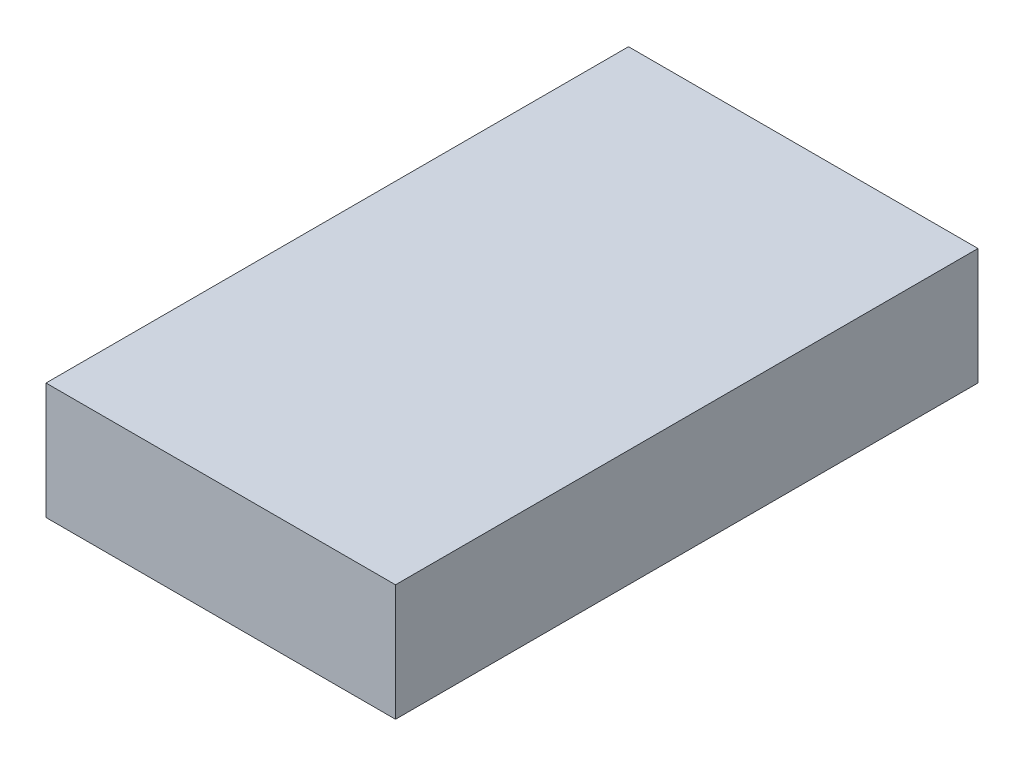
ISO-10303-21;
HEADER;
FILE_DESCRIPTION(('STEP AP214'),'2;1');
FILE_NAME('part.step','',(''),(''),'','','');
FILE_SCHEMA(('AUTOMOTIVE_DESIGN { 1 0 10303 214 1 1 1 1 }'));
ENDSEC;
DATA;
#1=APPLICATION_CONTEXT('core data for automotive mechanical design processes');
#2=APPLICATION_PROTOCOL_DEFINITION('international standard','automotive_design',2000,#1);
#3=PRODUCT_CONTEXT('',#1,'mechanical');
#4=PRODUCT('Part','Part','',(#3));
#5=PRODUCT_RELATED_PRODUCT_CATEGORY('part','',(#4));
#6=PRODUCT_DEFINITION_FORMATION('','',#4);
#7=PRODUCT_DEFINITION_CONTEXT('part definition',#1,'design');
#8=PRODUCT_DEFINITION('design','',#6,#7);
#9=PRODUCT_DEFINITION_SHAPE('','',#8);
#10=(LENGTH_UNIT() NAMED_UNIT(*) SI_UNIT(.MILLI.,.METRE.));
#11=(NAMED_UNIT(*) PLANE_ANGLE_UNIT() SI_UNIT($,.RADIAN.));
#12=(NAMED_UNIT(*) SI_UNIT($,.STERADIAN.) SOLID_ANGLE_UNIT());
#13=UNCERTAINTY_MEASURE_WITH_UNIT(LENGTH_MEASURE(1.E-05),#10,'distance_accuracy_value','');
#14=(GEOMETRIC_REPRESENTATION_CONTEXT(3) GLOBAL_UNCERTAINTY_ASSIGNED_CONTEXT((#13)) GLOBAL_UNIT_ASSIGNED_CONTEXT((#10,
#11,#12)) REPRESENTATION_CONTEXT('',''));
#15=CARTESIAN_POINT('',(0.,0.,0.));
#16=DIRECTION('',(0.,0.,1.));
#17=DIRECTION('',(1.,0.,0.));
#18=AXIS2_PLACEMENT_3D('',#15,#16,#17);
#19=CARTESIAN_POINT('',(75.,50.,125.));
#20=DIRECTION('',(-1.,0.,0.));
#21=DIRECTION('',(0.,0.,1.));
#22=AXIS2_PLACEMENT_3D('',#19,#20,#21);
#23=PLANE('',#22);
#24=DIRECTION('',(0.,0.,-1.));
#25=VECTOR('',#24,1.);
#26=CARTESIAN_POINT('',(75.,0.,125.));
#27=LINE('',#26,#25);
#28=CARTESIAN_POINT('',(75.,0.,125.));
#29=VERTEX_POINT('',#28);
#30=CARTESIAN_POINT('',(75.,0.,-125.));
#31=VERTEX_POINT('',#30);
#32=EDGE_CURVE('E104',#29,#31,#27,.T.);
#33=ORIENTED_EDGE('',*,*,#32,.T.);
#34=DIRECTION('',(0.,-1.,0.));
#35=VECTOR('',#34,1.);
#36=CARTESIAN_POINT('',(75.,50.,-125.));
#37=LINE('',#36,#35);
#38=CARTESIAN_POINT('',(75.,50.,-125.));
#39=VERTEX_POINT('',#38);
#40=EDGE_CURVE('E11',#39,#31,#37,.T.);
#41=ORIENTED_EDGE('',*,*,#40,.F.);
#42=DIRECTION('',(0.,0.,-1.));
#43=VECTOR('',#42,1.);
#44=CARTESIAN_POINT('',(75.,50.,125.));
#45=LINE('',#44,#43);
#46=CARTESIAN_POINT('',(75.,50.,125.));
#47=VERTEX_POINT('',#46);
#48=EDGE_CURVE('E92',#47,#39,#45,.T.);
#49=ORIENTED_EDGE('',*,*,#48,.F.);
#50=DIRECTION('',(0.,-1.,0.));
#51=VECTOR('',#50,1.);
#52=CARTESIAN_POINT('',(75.,50.,125.));
#53=LINE('',#52,#51);
#54=EDGE_CURVE('E100',#47,#29,#53,.T.);
#55=ORIENTED_EDGE('',*,*,#54,.T.);
#56=EDGE_LOOP('',(#33,#41,#49,#55));
#57=FACE_BOUND('',#56,.T.);
#58=ADVANCED_FACE('F41',(#57),#23,.F.);
#59=CARTESIAN_POINT('',(-75.,50.,-125.));
#60=DIRECTION('',(0.,0.,1.));
#61=DIRECTION('',(1.,0.,0.));
#62=AXIS2_PLACEMENT_3D('',#59,#60,#61);
#63=PLANE('',#62);
#64=DIRECTION('',(-1.,0.,0.));
#65=VECTOR('',#64,1.);
#66=CARTESIAN_POINT('',(-75.,0.,-125.));
#67=LINE('',#66,#65);
#68=CARTESIAN_POINT('',(-75.,0.,-125.));
#69=VERTEX_POINT('',#68);
#70=EDGE_CURVE('E96',#31,#69,#67,.T.);
#71=ORIENTED_EDGE('',*,*,#70,.T.);
#72=DIRECTION('',(0.,-1.,0.));
#73=VECTOR('',#72,1.);
#74=CARTESIAN_POINT('',(-75.,50.,-125.));
#75=LINE('',#74,#73);
#76=CARTESIAN_POINT('',(-75.,50.,-125.));
#77=VERTEX_POINT('',#76);
#78=EDGE_CURVE('E49',#77,#69,#75,.T.);
#79=ORIENTED_EDGE('',*,*,#78,.F.);
#80=DIRECTION('',(-1.,0.,0.));
#81=VECTOR('',#80,1.);
#82=CARTESIAN_POINT('',(-75.,50.,-125.));
#83=LINE('',#82,#81);
#84=EDGE_CURVE('E87',#39,#77,#83,.T.);
#85=ORIENTED_EDGE('',*,*,#84,.F.);
#86=ORIENTED_EDGE('',*,*,#40,.T.);
#87=EDGE_LOOP('',(#71,#79,#85,#86));
#88=FACE_BOUND('',#87,.T.);
#89=ADVANCED_FACE('F95',(#88),#63,.F.);
#90=CARTESIAN_POINT('',(-75.,50.,125.));
#91=DIRECTION('',(1.,0.,0.));
#92=DIRECTION('',(0.,0.,-1.));
#93=AXIS2_PLACEMENT_3D('',#90,#91,#92);
#94=PLANE('',#93);
#95=DIRECTION('',(0.,0.,1.));
#96=VECTOR('',#95,1.);
#97=CARTESIAN_POINT('',(-75.,0.,125.));
#98=LINE('',#97,#96);
#99=CARTESIAN_POINT('',(-75.,0.,125.));
#100=VERTEX_POINT('',#99);
#101=EDGE_CURVE('E74',#69,#100,#98,.T.);
#102=ORIENTED_EDGE('',*,*,#101,.T.);
#103=DIRECTION('',(0.,-1.,0.));
#104=VECTOR('',#103,1.);
#105=CARTESIAN_POINT('',(-75.,50.,125.));
#106=LINE('',#105,#104);
#107=CARTESIAN_POINT('',(-75.,50.,125.));
#108=VERTEX_POINT('',#107);
#109=EDGE_CURVE('E97',#108,#100,#106,.T.);
#110=ORIENTED_EDGE('',*,*,#109,.F.);
#111=DIRECTION('',(0.,0.,1.));
#112=VECTOR('',#111,1.);
#113=CARTESIAN_POINT('',(-75.,50.,125.));
#114=LINE('',#113,#112);
#115=EDGE_CURVE('E90',#77,#108,#114,.T.);
#116=ORIENTED_EDGE('',*,*,#115,.F.);
#117=ORIENTED_EDGE('',*,*,#78,.T.);
#118=EDGE_LOOP('',(#102,#110,#116,#117));
#119=FACE_BOUND('',#118,.T.);
#120=ADVANCED_FACE('F98',(#119),#94,.F.);
#121=CARTESIAN_POINT('',(-75.,50.,125.));
#122=DIRECTION('',(0.,0.,-1.));
#123=DIRECTION('',(-1.,0.,0.));
#124=AXIS2_PLACEMENT_3D('',#121,#122,#123);
#125=PLANE('',#124);
#126=DIRECTION('',(1.,0.,0.));
#127=VECTOR('',#126,1.);
#128=CARTESIAN_POINT('',(-75.,0.,125.));
#129=LINE('',#128,#127);
#130=EDGE_CURVE('E80',#100,#29,#129,.T.);
#131=ORIENTED_EDGE('',*,*,#130,.T.);
#132=ORIENTED_EDGE('',*,*,#54,.F.);
#133=DIRECTION('',(1.,0.,0.));
#134=VECTOR('',#133,1.);
#135=CARTESIAN_POINT('',(-75.,50.,125.));
#136=LINE('',#135,#134);
#137=EDGE_CURVE('E57',#108,#47,#136,.T.);
#138=ORIENTED_EDGE('',*,*,#137,.F.);
#139=ORIENTED_EDGE('',*,*,#109,.T.);
#140=EDGE_LOOP('',(#131,#132,#138,#139));
#141=FACE_BOUND('',#140,.T.);
#142=ADVANCED_FACE('F111',(#141),#125,.F.);
#143=CARTESIAN_POINT('',(0.,50.,0.));
#144=DIRECTION('',(0.,-1.,0.));
#145=DIRECTION('',(0.,0.,-1.));
#146=AXIS2_PLACEMENT_3D('',#143,#144,#145);
#147=PLANE('',#146);
#148=ORIENTED_EDGE('',*,*,#48,.T.);
#149=ORIENTED_EDGE('',*,*,#84,.T.);
#150=ORIENTED_EDGE('',*,*,#115,.T.);
#151=ORIENTED_EDGE('',*,*,#137,.T.);
#152=EDGE_LOOP('',(#148,#149,#150,#151));
#153=FACE_BOUND('',#152,.T.);
#154=ADVANCED_FACE('F88',(#153),#147,.F.);
#155=CARTESIAN_POINT('',(0.,0.,0.));
#156=DIRECTION('',(0.,-1.,0.));
#157=DIRECTION('',(0.,0.,-1.));
#158=AXIS2_PLACEMENT_3D('',#155,#156,#157);
#159=PLANE('',#158);
#160=ORIENTED_EDGE('',*,*,#32,.F.);
#161=ORIENTED_EDGE('',*,*,#130,.F.);
#162=ORIENTED_EDGE('',*,*,#101,.F.);
#163=ORIENTED_EDGE('',*,*,#70,.F.);
#164=EDGE_LOOP('',(#160,#161,#162,#163));
#165=FACE_BOUND('',#164,.T.);
#166=ADVANCED_FACE('F114',(#165),#159,.T.);
#167=CLOSED_SHELL('',(#58,#89,#120,#142,#154,#166));
#168=MANIFOLD_SOLID_BREP('B2',#167);
#169=ADVANCED_BREP_SHAPE_REPRESENTATION('',(#18,#168),#14);
#170=SHAPE_DEFINITION_REPRESENTATION(#9,#169);
ENDSEC;
END-ISO-10303-21;
